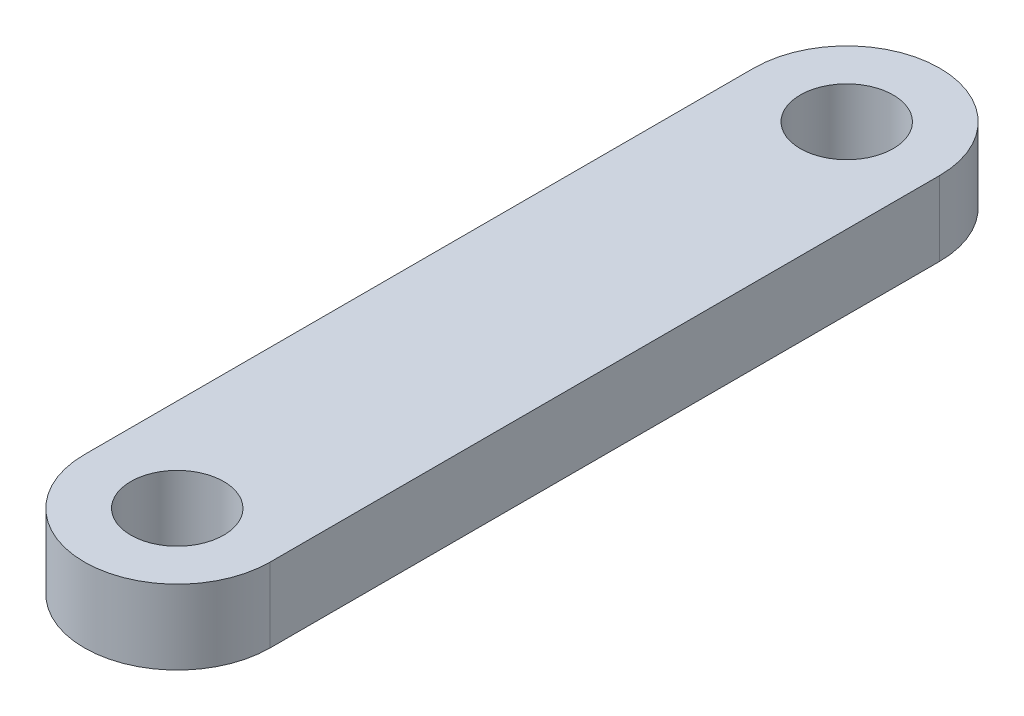
ISO-10303-21;
HEADER;
FILE_DESCRIPTION(('STEP AP214'),'2;1');
FILE_NAME('part.step','',(''),(''),'','','');
FILE_SCHEMA(('AUTOMOTIVE_DESIGN { 1 0 10303 214 1 1 1 1 }'));
ENDSEC;
DATA;
#1=APPLICATION_CONTEXT('core data for automotive mechanical design processes');
#2=APPLICATION_PROTOCOL_DEFINITION('international standard','automotive_design',2000,#1);
#3=PRODUCT_CONTEXT('',#1,'mechanical');
#4=PRODUCT('Part','Part','',(#3));
#5=PRODUCT_RELATED_PRODUCT_CATEGORY('part','',(#4));
#6=PRODUCT_DEFINITION_FORMATION('','',#4);
#7=PRODUCT_DEFINITION_CONTEXT('part definition',#1,'design');
#8=PRODUCT_DEFINITION('design','',#6,#7);
#9=PRODUCT_DEFINITION_SHAPE('','',#8);
#10=(LENGTH_UNIT() NAMED_UNIT(*) SI_UNIT(.MILLI.,.METRE.));
#11=(NAMED_UNIT(*) PLANE_ANGLE_UNIT() SI_UNIT($,.RADIAN.));
#12=(NAMED_UNIT(*) SI_UNIT($,.STERADIAN.) SOLID_ANGLE_UNIT());
#13=UNCERTAINTY_MEASURE_WITH_UNIT(LENGTH_MEASURE(1.E-05),#10,'distance_accuracy_value','');
#14=(GEOMETRIC_REPRESENTATION_CONTEXT(3) GLOBAL_UNCERTAINTY_ASSIGNED_CONTEXT((#13)) GLOBAL_UNIT_ASSIGNED_CONTEXT((#10,
#11,#12)) REPRESENTATION_CONTEXT('',''));
#15=CARTESIAN_POINT('',(0.,0.,0.));
#16=DIRECTION('',(0.,0.,1.));
#17=DIRECTION('',(1.,0.,0.));
#18=AXIS2_PLACEMENT_3D('',#15,#16,#17);
#19=CARTESIAN_POINT('',(0.,2.,0.));
#20=DIRECTION('',(0.,1.,0.));
#21=DIRECTION('',(0.,0.,1.));
#22=AXIS2_PLACEMENT_3D('',#19,#20,#21);
#23=PLANE('',#22);
#24=CARTESIAN_POINT('',(0.,2.,-18.));
#25=DIRECTION('',(0.,1.,0.));
#26=DIRECTION('',(0.,0.,1.));
#27=AXIS2_PLACEMENT_3D('',#24,#25,#26);
#28=CIRCLE('',#27,1.25);
#29=CARTESIAN_POINT('',(0.,2.,-16.75));
#30=VERTEX_POINT('',#29);
#31=EDGE_CURVE('E103',#30,#30,#28,.T.);
#32=ORIENTED_EDGE('',*,*,#31,.F.);
#33=EDGE_LOOP('',(#32));
#34=FACE_BOUND('',#33,.T.);
#35=CARTESIAN_POINT('',(0.,2.,0.));
#36=DIRECTION('',(0.,1.,0.));
#37=DIRECTION('',(0.,0.,1.));
#38=AXIS2_PLACEMENT_3D('',#35,#36,#37);
#39=CIRCLE('',#38,2.5);
#40=CARTESIAN_POINT('',(-2.50000000000001,2.,0.));
#41=VERTEX_POINT('',#40);
#42=CARTESIAN_POINT('',(2.5,2.,0.));
#43=VERTEX_POINT('',#42);
#44=EDGE_CURVE('E87',#41,#43,#39,.T.);
#45=ORIENTED_EDGE('',*,*,#44,.T.);
#46=DIRECTION('',(0.,0.,-1.));
#47=VECTOR('',#46,1.);
#48=CARTESIAN_POINT('',(2.5,2.,-18.));
#49=LINE('',#48,#47);
#50=CARTESIAN_POINT('',(2.5,2.,-18.));
#51=VERTEX_POINT('',#50);
#52=EDGE_CURVE('E82',#43,#51,#49,.T.);
#53=ORIENTED_EDGE('',*,*,#52,.T.);
#54=CARTESIAN_POINT('',(0.,2.,-18.));
#55=DIRECTION('',(0.,1.,0.));
#56=DIRECTION('',(0.,0.,1.));
#57=AXIS2_PLACEMENT_3D('',#54,#55,#56);
#58=CIRCLE('',#57,2.5);
#59=CARTESIAN_POINT('',(-2.50000000000001,2.,-18.));
#60=VERTEX_POINT('',#59);
#61=EDGE_CURVE('E85',#51,#60,#58,.T.);
#62=ORIENTED_EDGE('',*,*,#61,.T.);
#63=DIRECTION('',(0.,0.,1.));
#64=VECTOR('',#63,1.);
#65=CARTESIAN_POINT('',(-2.50000000000001,2.,0.));
#66=LINE('',#65,#64);
#67=EDGE_CURVE('E52',#60,#41,#66,.T.);
#68=ORIENTED_EDGE('',*,*,#67,.T.);
#69=EDGE_LOOP('',(#45,#53,#62,#68));
#70=FACE_BOUND('',#69,.T.);
#71=CARTESIAN_POINT('',(0.,2.,0.));
#72=DIRECTION('',(0.,1.,0.));
#73=DIRECTION('',(0.,0.,1.));
#74=AXIS2_PLACEMENT_3D('',#71,#72,#73);
#75=CIRCLE('',#74,1.25000000000001);
#76=CARTESIAN_POINT('',(0.,2.,1.25000000000001));
#77=VERTEX_POINT('',#76);
#78=EDGE_CURVE('E109',#77,#77,#75,.T.);
#79=ORIENTED_EDGE('',*,*,#78,.F.);
#80=EDGE_LOOP('',(#79));
#81=FACE_BOUND('',#80,.T.);
#82=ADVANCED_FACE('F33',(#34,#70,#81),#23,.T.);
#83=CARTESIAN_POINT('',(0.,0.,0.));
#84=DIRECTION('',(0.,1.,0.));
#85=DIRECTION('',(0.,0.,1.));
#86=AXIS2_PLACEMENT_3D('',#83,#84,#85);
#87=PLANE('',#86);
#88=CARTESIAN_POINT('',(0.,0.,0.));
#89=DIRECTION('',(0.,1.,0.));
#90=DIRECTION('',(0.,0.,1.));
#91=AXIS2_PLACEMENT_3D('',#88,#89,#90);
#92=CIRCLE('',#91,2.5);
#93=CARTESIAN_POINT('',(-2.50000000000001,0.,0.));
#94=VERTEX_POINT('',#93);
#95=CARTESIAN_POINT('',(2.5,0.,0.));
#96=VERTEX_POINT('',#95);
#97=EDGE_CURVE('E100',#94,#96,#92,.T.);
#98=ORIENTED_EDGE('',*,*,#97,.F.);
#99=DIRECTION('',(0.,0.,1.));
#100=VECTOR('',#99,1.);
#101=CARTESIAN_POINT('',(-2.50000000000001,0.,0.));
#102=LINE('',#101,#100);
#103=CARTESIAN_POINT('',(-2.50000000000001,0.,-18.));
#104=VERTEX_POINT('',#103);
#105=EDGE_CURVE('E75',#104,#94,#102,.T.);
#106=ORIENTED_EDGE('',*,*,#105,.F.);
#107=CARTESIAN_POINT('',(0.,0.,-18.));
#108=DIRECTION('',(0.,1.,0.));
#109=DIRECTION('',(0.,0.,1.));
#110=AXIS2_PLACEMENT_3D('',#107,#108,#109);
#111=CIRCLE('',#110,2.5);
#112=CARTESIAN_POINT('',(2.5,0.,-18.));
#113=VERTEX_POINT('',#112);
#114=EDGE_CURVE('E69',#113,#104,#111,.T.);
#115=ORIENTED_EDGE('',*,*,#114,.F.);
#116=DIRECTION('',(0.,0.,-1.));
#117=VECTOR('',#116,1.);
#118=CARTESIAN_POINT('',(2.5,0.,-18.));
#119=LINE('',#118,#117);
#120=EDGE_CURVE('E91',#96,#113,#119,.T.);
#121=ORIENTED_EDGE('',*,*,#120,.F.);
#122=EDGE_LOOP('',(#98,#106,#115,#121));
#123=FACE_BOUND('',#122,.T.);
#124=CARTESIAN_POINT('',(0.,0.,-18.));
#125=DIRECTION('',(0.,1.,0.));
#126=DIRECTION('',(0.,0.,1.));
#127=AXIS2_PLACEMENT_3D('',#124,#125,#126);
#128=CIRCLE('',#127,1.25);
#129=CARTESIAN_POINT('',(0.,0.,-16.75));
#130=VERTEX_POINT('',#129);
#131=EDGE_CURVE('E37',#130,#130,#128,.T.);
#132=ORIENTED_EDGE('',*,*,#131,.T.);
#133=EDGE_LOOP('',(#132));
#134=FACE_BOUND('',#133,.T.);
#135=CARTESIAN_POINT('',(0.,0.,0.));
#136=DIRECTION('',(0.,1.,0.));
#137=DIRECTION('',(0.,0.,1.));
#138=AXIS2_PLACEMENT_3D('',#135,#136,#137);
#139=CIRCLE('',#138,1.25000000000001);
#140=CARTESIAN_POINT('',(0.,0.,1.25000000000001));
#141=VERTEX_POINT('',#140);
#142=EDGE_CURVE('E112',#141,#141,#139,.T.);
#143=ORIENTED_EDGE('',*,*,#142,.T.);
#144=EDGE_LOOP('',(#143));
#145=FACE_BOUND('',#144,.T.);
#146=ADVANCED_FACE('F120',(#123,#134,#145),#87,.F.);
#147=CARTESIAN_POINT('',(0.,2.,0.));
#148=DIRECTION('',(0.,-1.,0.));
#149=DIRECTION('',(0.,0.,-1.));
#150=AXIS2_PLACEMENT_3D('',#147,#148,#149);
#151=CYLINDRICAL_SURFACE('',#150,2.5);
#152=ORIENTED_EDGE('',*,*,#97,.T.);
#153=DIRECTION('',(0.,-1.,0.));
#154=VECTOR('',#153,1.);
#155=CARTESIAN_POINT('',(2.5,2.,0.));
#156=LINE('',#155,#154);
#157=EDGE_CURVE('E12',#43,#96,#156,.T.);
#158=ORIENTED_EDGE('',*,*,#157,.F.);
#159=ORIENTED_EDGE('',*,*,#44,.F.);
#160=DIRECTION('',(0.,-1.,0.));
#161=VECTOR('',#160,1.);
#162=CARTESIAN_POINT('',(-2.50000000000001,2.,0.));
#163=LINE('',#162,#161);
#164=EDGE_CURVE('E96',#41,#94,#163,.T.);
#165=ORIENTED_EDGE('',*,*,#164,.T.);
#166=EDGE_LOOP('',(#152,#158,#159,#165));
#167=FACE_BOUND('',#166,.T.);
#168=ADVANCED_FACE('F138',(#167),#151,.T.);
#169=CARTESIAN_POINT('',(2.5,2.,-18.));
#170=DIRECTION('',(-1.,0.,0.));
#171=DIRECTION('',(0.,0.,1.));
#172=AXIS2_PLACEMENT_3D('',#169,#170,#171);
#173=PLANE('',#172);
#174=ORIENTED_EDGE('',*,*,#120,.T.);
#175=DIRECTION('',(0.,-1.,0.));
#176=VECTOR('',#175,1.);
#177=CARTESIAN_POINT('',(2.5,2.,-18.));
#178=LINE('',#177,#176);
#179=EDGE_CURVE('E43',#51,#113,#178,.T.);
#180=ORIENTED_EDGE('',*,*,#179,.F.);
#181=ORIENTED_EDGE('',*,*,#52,.F.);
#182=ORIENTED_EDGE('',*,*,#157,.T.);
#183=EDGE_LOOP('',(#174,#180,#181,#182));
#184=FACE_BOUND('',#183,.T.);
#185=ADVANCED_FACE('F90',(#184),#173,.F.);
#186=CARTESIAN_POINT('',(0.,2.,-18.));
#187=DIRECTION('',(0.,-1.,0.));
#188=DIRECTION('',(0.,0.,-1.));
#189=AXIS2_PLACEMENT_3D('',#186,#187,#188);
#190=CYLINDRICAL_SURFACE('',#189,2.5);
#191=ORIENTED_EDGE('',*,*,#114,.T.);
#192=DIRECTION('',(0.,-1.,0.));
#193=VECTOR('',#192,1.);
#194=CARTESIAN_POINT('',(-2.50000000000001,2.,-18.));
#195=LINE('',#194,#193);
#196=EDGE_CURVE('E92',#60,#104,#195,.T.);
#197=ORIENTED_EDGE('',*,*,#196,.F.);
#198=ORIENTED_EDGE('',*,*,#61,.F.);
#199=ORIENTED_EDGE('',*,*,#179,.T.);
#200=EDGE_LOOP('',(#191,#197,#198,#199));
#201=FACE_BOUND('',#200,.T.);
#202=ADVANCED_FACE('F94',(#201),#190,.T.);
#203=CARTESIAN_POINT('',(-2.50000000000001,2.,0.));
#204=DIRECTION('',(1.,0.,0.));
#205=DIRECTION('',(0.,0.,-1.));
#206=AXIS2_PLACEMENT_3D('',#203,#204,#205);
#207=PLANE('',#206);
#208=ORIENTED_EDGE('',*,*,#105,.T.);
#209=ORIENTED_EDGE('',*,*,#164,.F.);
#210=ORIENTED_EDGE('',*,*,#67,.F.);
#211=ORIENTED_EDGE('',*,*,#196,.T.);
#212=EDGE_LOOP('',(#208,#209,#210,#211));
#213=FACE_BOUND('',#212,.T.);
#214=ADVANCED_FACE('F125',(#213),#207,.F.);
#215=CARTESIAN_POINT('',(0.,2.,-18.));
#216=DIRECTION('',(0.,-1.,0.));
#217=DIRECTION('',(0.,0.,-1.));
#218=AXIS2_PLACEMENT_3D('',#215,#216,#217);
#219=CYLINDRICAL_SURFACE('',#218,1.25);
#220=ORIENTED_EDGE('',*,*,#31,.T.);
#221=EDGE_LOOP('',(#220));
#222=FACE_BOUND('',#221,.T.);
#223=ORIENTED_EDGE('',*,*,#131,.F.);
#224=EDGE_LOOP('',(#223));
#225=FACE_BOUND('',#224,.T.);
#226=ADVANCED_FACE('F35',(#222,#225),#219,.F.);
#227=CARTESIAN_POINT('',(0.,2.,0.));
#228=DIRECTION('',(0.,-1.,0.));
#229=DIRECTION('',(0.,0.,-1.));
#230=AXIS2_PLACEMENT_3D('',#227,#228,#229);
#231=CYLINDRICAL_SURFACE('',#230,1.25000000000001);
#232=ORIENTED_EDGE('',*,*,#78,.T.);
#233=EDGE_LOOP('',(#232));
#234=FACE_BOUND('',#233,.T.);
#235=ORIENTED_EDGE('',*,*,#142,.F.);
#236=EDGE_LOOP('',(#235));
#237=FACE_BOUND('',#236,.T.);
#238=ADVANCED_FACE('F124',(#234,#237),#231,.F.);
#239=CLOSED_SHELL('',(#82,#146,#168,#185,#202,#214,#226,#238));
#240=MANIFOLD_SOLID_BREP('B2',#239);
#241=ADVANCED_BREP_SHAPE_REPRESENTATION('',(#18,#240),#14);
#242=SHAPE_DEFINITION_REPRESENTATION(#9,#241);
ENDSEC;
END-ISO-10303-21;
